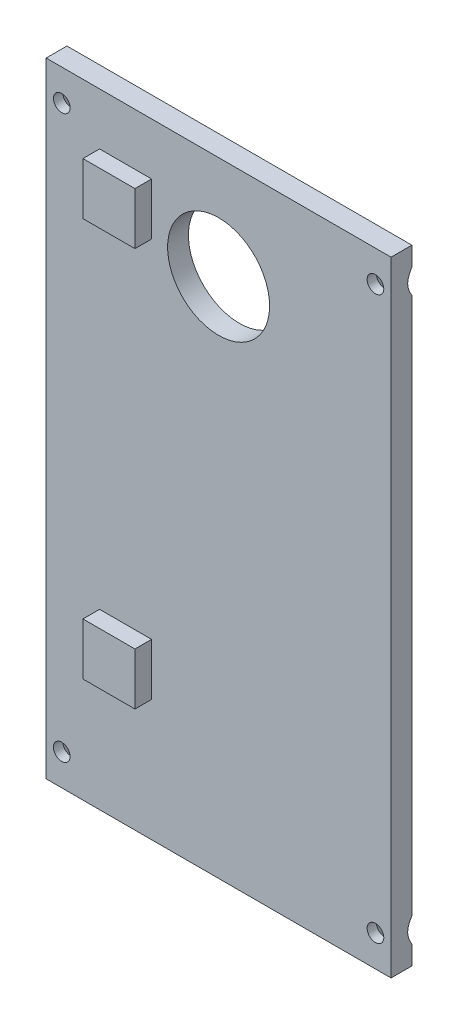
ISO-10303-21;
HEADER;
FILE_DESCRIPTION(('STEP AP214'),'2;1');
FILE_NAME('part.step','',(''),(''),'','','');
FILE_SCHEMA(('AUTOMOTIVE_DESIGN { 1 0 10303 214 1 1 1 1 }'));
ENDSEC;
DATA;
#1=APPLICATION_CONTEXT('core data for automotive mechanical design processes');
#2=APPLICATION_PROTOCOL_DEFINITION('international standard','automotive_design',2000,#1);
#3=PRODUCT_CONTEXT('',#1,'mechanical');
#4=PRODUCT('Part','Part','',(#3));
#5=PRODUCT_RELATED_PRODUCT_CATEGORY('part','',(#4));
#6=PRODUCT_DEFINITION_FORMATION('','',#4);
#7=PRODUCT_DEFINITION_CONTEXT('part definition',#1,'design');
#8=PRODUCT_DEFINITION('design','',#6,#7);
#9=PRODUCT_DEFINITION_SHAPE('','',#8);
#10=(LENGTH_UNIT() NAMED_UNIT(*) SI_UNIT(.MILLI.,.METRE.));
#11=(NAMED_UNIT(*) PLANE_ANGLE_UNIT() SI_UNIT($,.RADIAN.));
#12=(NAMED_UNIT(*) SI_UNIT($,.STERADIAN.) SOLID_ANGLE_UNIT());
#13=UNCERTAINTY_MEASURE_WITH_UNIT(LENGTH_MEASURE(1.E-05),#10,'distance_accuracy_value','');
#14=(GEOMETRIC_REPRESENTATION_CONTEXT(3) GLOBAL_UNCERTAINTY_ASSIGNED_CONTEXT((#13)) GLOBAL_UNIT_ASSIGNED_CONTEXT((#10,
#11,#12)) REPRESENTATION_CONTEXT('',''));
#15=CARTESIAN_POINT('',(0.,0.,0.));
#16=DIRECTION('',(0.,0.,1.));
#17=DIRECTION('',(1.,0.,0.));
#18=AXIS2_PLACEMENT_3D('',#15,#16,#17);
#19=CARTESIAN_POINT('',(0.,0.,2.));
#20=DIRECTION('',(0.,0.,-1.));
#21=DIRECTION('',(-1.,0.,0.));
#22=AXIS2_PLACEMENT_3D('',#19,#20,#21);
#23=PLANE('',#22);
#24=CARTESIAN_POINT('',(15.075,-27.,2.));
#25=DIRECTION('',(0.,0.,-1.));
#26=DIRECTION('',(-1.,0.,0.));
#27=AXIS2_PLACEMENT_3D('',#24,#25,#26);
#28=CIRCLE('',#27,0.8);
#29=CARTESIAN_POINT('',(14.275,-27.,2.));
#30=VERTEX_POINT('',#29);
#31=EDGE_CURVE('E410',#30,#30,#28,.F.);
#32=ORIENTED_EDGE('',*,*,#31,.F.);
#33=EDGE_LOOP('',(#32));
#34=FACE_BOUND('',#33,.T.);
#35=CARTESIAN_POINT('',(-15.075,-27.,2.));
#36=DIRECTION('',(0.,0.,-1.));
#37=DIRECTION('',(-1.,0.,0.));
#38=AXIS2_PLACEMENT_3D('',#35,#36,#37);
#39=CIRCLE('',#38,0.8);
#40=CARTESIAN_POINT('',(-15.875,-27.,2.));
#41=VERTEX_POINT('',#40);
#42=EDGE_CURVE('E405',#41,#41,#39,.F.);
#43=ORIENTED_EDGE('',*,*,#42,.F.);
#44=EDGE_LOOP('',(#43));
#45=FACE_BOUND('',#44,.T.);
#46=CARTESIAN_POINT('',(-15.075,27.,2.));
#47=DIRECTION('',(0.,0.,-1.));
#48=DIRECTION('',(-1.,0.,0.));
#49=AXIS2_PLACEMENT_3D('',#46,#47,#48);
#50=CIRCLE('',#49,0.8);
#51=CARTESIAN_POINT('',(-15.875,27.,2.));
#52=VERTEX_POINT('',#51);
#53=EDGE_CURVE('E402',#52,#52,#50,.F.);
#54=ORIENTED_EDGE('',*,*,#53,.F.);
#55=EDGE_LOOP('',(#54));
#56=FACE_BOUND('',#55,.T.);
#57=CARTESIAN_POINT('',(15.075,27.,2.));
#58=DIRECTION('',(0.,0.,-1.));
#59=DIRECTION('',(-1.,0.,0.));
#60=AXIS2_PLACEMENT_3D('',#57,#58,#59);
#61=CIRCLE('',#60,0.8);
#62=CARTESIAN_POINT('',(14.275,27.,2.));
#63=VERTEX_POINT('',#62);
#64=EDGE_CURVE('E404',#63,#63,#61,.F.);
#65=ORIENTED_EDGE('',*,*,#64,.F.);
#66=EDGE_LOOP('',(#65));
#67=FACE_BOUND('',#66,.T.);
#68=DIRECTION('',(0.,-1.,0.));
#69=VECTOR('',#68,1.);
#70=CARTESIAN_POINT('',(-11.44,25.,2.));
#71=LINE('',#70,#69);
#72=CARTESIAN_POINT('',(-11.44,25.,2.));
#73=VERTEX_POINT('',#72);
#74=CARTESIAN_POINT('',(-11.44,20.,2.));
#75=VERTEX_POINT('',#74);
#76=EDGE_CURVE('E176',#73,#75,#71,.T.);
#77=ORIENTED_EDGE('',*,*,#76,.F.);
#78=DIRECTION('',(-1.,0.,0.));
#79=VECTOR('',#78,1.);
#80=CARTESIAN_POINT('',(-11.44,25.,2.));
#81=LINE('',#80,#79);
#82=CARTESIAN_POINT('',(-6.44,25.,2.));
#83=VERTEX_POINT('',#82);
#84=EDGE_CURVE('E189',#83,#73,#81,.T.);
#85=ORIENTED_EDGE('',*,*,#84,.F.);
#86=DIRECTION('',(0.,1.,0.));
#87=VECTOR('',#86,1.);
#88=CARTESIAN_POINT('',(-6.44,25.,2.));
#89=LINE('',#88,#87);
#90=CARTESIAN_POINT('',(-6.44,20.,2.));
#91=VERTEX_POINT('',#90);
#92=EDGE_CURVE('E198',#91,#83,#89,.T.);
#93=ORIENTED_EDGE('',*,*,#92,.F.);
#94=DIRECTION('',(1.,0.,0.));
#95=VECTOR('',#94,1.);
#96=CARTESIAN_POINT('',(-11.44,20.,2.));
#97=LINE('',#96,#95);
#98=EDGE_CURVE('E179',#75,#91,#97,.T.);
#99=ORIENTED_EDGE('',*,*,#98,.F.);
#100=EDGE_LOOP('',(#77,#85,#93,#99));
#101=FACE_BOUND('',#100,.T.);
#102=DIRECTION('',(0.,1.,0.));
#103=VECTOR('',#102,1.);
#104=CARTESIAN_POINT('',(16.575,-30.,2.));
#105=LINE('',#104,#103);
#106=CARTESIAN_POINT('',(16.575,-30.,2.));
#107=VERTEX_POINT('',#106);
#108=CARTESIAN_POINT('',(16.575,30.,2.));
#109=VERTEX_POINT('',#108);
#110=EDGE_CURVE('E221',#107,#109,#105,.T.);
#111=ORIENTED_EDGE('',*,*,#110,.T.);
#112=DIRECTION('',(-1.,0.,0.));
#113=VECTOR('',#112,1.);
#114=CARTESIAN_POINT('',(-16.575,30.,2.));
#115=LINE('',#114,#113);
#116=CARTESIAN_POINT('',(-16.575,30.,2.));
#117=VERTEX_POINT('',#116);
#118=EDGE_CURVE('E224',#109,#117,#115,.T.);
#119=ORIENTED_EDGE('',*,*,#118,.T.);
#120=DIRECTION('',(0.,-1.,0.));
#121=VECTOR('',#120,1.);
#122=CARTESIAN_POINT('',(-16.575,-30.,2.));
#123=LINE('',#122,#121);
#124=CARTESIAN_POINT('',(-16.575,-30.,2.));
#125=VERTEX_POINT('',#124);
#126=EDGE_CURVE('E227',#117,#125,#123,.T.);
#127=ORIENTED_EDGE('',*,*,#126,.T.);
#128=DIRECTION('',(1.,0.,0.));
#129=VECTOR('',#128,1.);
#130=CARTESIAN_POINT('',(-16.575,-30.,2.));
#131=LINE('',#130,#129);
#132=EDGE_CURVE('E229',#125,#107,#131,.T.);
#133=ORIENTED_EDGE('',*,*,#132,.T.);
#134=EDGE_LOOP('',(#111,#119,#127,#133));
#135=FACE_BOUND('',#134,.T.);
#136=CARTESIAN_POINT('',(0.,20.1,2.));
#137=DIRECTION('',(0.,0.,1.));
#138=DIRECTION('',(1.,0.,0.));
#139=AXIS2_PLACEMENT_3D('',#136,#137,#138);
#140=CIRCLE('',#139,4.9);
#141=CARTESIAN_POINT('',(4.9,20.1,2.));
#142=VERTEX_POINT('',#141);
#143=EDGE_CURVE('E215',#142,#142,#140,.T.);
#144=ORIENTED_EDGE('',*,*,#143,.F.);
#145=EDGE_LOOP('',(#144));
#146=FACE_BOUND('',#145,.T.);
#147=DIRECTION('',(0.,-1.,0.));
#148=VECTOR('',#147,1.);
#149=CARTESIAN_POINT('',(-11.44,-18.32,2.));
#150=LINE('',#149,#148);
#151=CARTESIAN_POINT('',(-11.44,-13.32,2.));
#152=VERTEX_POINT('',#151);
#153=CARTESIAN_POINT('',(-11.44,-18.32,2.));
#154=VERTEX_POINT('',#153);
#155=EDGE_CURVE('E175',#152,#154,#150,.T.);
#156=ORIENTED_EDGE('',*,*,#155,.F.);
#157=DIRECTION('',(-1.,0.,0.));
#158=VECTOR('',#157,1.);
#159=CARTESIAN_POINT('',(-11.44,-13.32,2.));
#160=LINE('',#159,#158);
#161=CARTESIAN_POINT('',(-6.43999999999999,-13.32,2.));
#162=VERTEX_POINT('',#161);
#163=EDGE_CURVE('E172',#162,#152,#160,.T.);
#164=ORIENTED_EDGE('',*,*,#163,.F.);
#165=DIRECTION('',(0.,1.,0.));
#166=VECTOR('',#165,1.);
#167=CARTESIAN_POINT('',(-6.43999999999999,-18.32,2.));
#168=LINE('',#167,#166);
#169=CARTESIAN_POINT('',(-6.43999999999999,-18.32,2.));
#170=VERTEX_POINT('',#169);
#171=EDGE_CURVE('E421',#170,#162,#168,.T.);
#172=ORIENTED_EDGE('',*,*,#171,.F.);
#173=DIRECTION('',(1.,0.,0.));
#174=VECTOR('',#173,1.);
#175=CARTESIAN_POINT('',(-11.44,-18.32,2.));
#176=LINE('',#175,#174);
#177=EDGE_CURVE('E419',#154,#170,#176,.T.);
#178=ORIENTED_EDGE('',*,*,#177,.F.);
#179=EDGE_LOOP('',(#156,#164,#172,#178));
#180=FACE_BOUND('',#179,.T.);
#181=ADVANCED_FACE('F37',(#34,#45,#56,#67,#101,#135,#146,#180),#23,.F.);
#182=CARTESIAN_POINT('',(0.,0.,0.));
#183=DIRECTION('',(0.,0.,-1.));
#184=DIRECTION('',(-1.,0.,0.));
#185=AXIS2_PLACEMENT_3D('',#182,#183,#184);
#186=PLANE('',#185);
#187=DIRECTION('',(0.,-1.,0.));
#188=VECTOR('',#187,1.);
#189=CARTESIAN_POINT('',(-16.575,-30.,0.));
#190=LINE('',#189,#188);
#191=CARTESIAN_POINT('',(-16.575,-28.1661903789691,0.));
#192=VERTEX_POINT('',#191);
#193=CARTESIAN_POINT('',(-16.575,-30.,0.));
#194=VERTEX_POINT('',#193);
#195=EDGE_CURVE('E238',#192,#194,#190,.T.);
#196=ORIENTED_EDGE('',*,*,#195,.F.);
#197=CARTESIAN_POINT('',(-15.075,-27.,0.));
#198=DIRECTION('',(0.,0.,-1.));
#199=DIRECTION('',(-1.,0.,0.));
#200=AXIS2_PLACEMENT_3D('',#197,#198,#199);
#201=CIRCLE('',#200,1.9);
#202=CARTESIAN_POINT('',(-16.575,-25.8338096210309,0.));
#203=VERTEX_POINT('',#202);
#204=EDGE_CURVE('E267',#192,#203,#201,.F.);
#205=ORIENTED_EDGE('',*,*,#204,.T.);
#206=CARTESIAN_POINT('',(-16.575,25.8338096210309,0.));
#207=VERTEX_POINT('',#206);
#208=EDGE_CURVE('E242',#207,#203,#190,.T.);
#209=ORIENTED_EDGE('',*,*,#208,.F.);
#210=CARTESIAN_POINT('',(-15.075,27.,0.));
#211=DIRECTION('',(0.,0.,-1.));
#212=DIRECTION('',(-1.,0.,0.));
#213=AXIS2_PLACEMENT_3D('',#210,#211,#212);
#214=CIRCLE('',#213,1.90000000000001);
#215=CARTESIAN_POINT('',(-16.575,28.1661903789691,0.));
#216=VERTEX_POINT('',#215);
#217=EDGE_CURVE('E261',#207,#216,#214,.F.);
#218=ORIENTED_EDGE('',*,*,#217,.T.);
#219=CARTESIAN_POINT('',(-16.575,30.,0.));
#220=VERTEX_POINT('',#219);
#221=EDGE_CURVE('E239',#220,#216,#190,.T.);
#222=ORIENTED_EDGE('',*,*,#221,.F.);
#223=DIRECTION('',(-1.,0.,0.));
#224=VECTOR('',#223,1.);
#225=CARTESIAN_POINT('',(-16.575,30.,0.));
#226=LINE('',#225,#224);
#227=CARTESIAN_POINT('',(16.575,30.,0.));
#228=VERTEX_POINT('',#227);
#229=EDGE_CURVE('E235',#228,#220,#226,.T.);
#230=ORIENTED_EDGE('',*,*,#229,.F.);
#231=DIRECTION('',(0.,1.,0.));
#232=VECTOR('',#231,1.);
#233=CARTESIAN_POINT('',(16.575,-30.,0.));
#234=LINE('',#233,#232);
#235=CARTESIAN_POINT('',(16.575,28.1661903789691,0.));
#236=VERTEX_POINT('',#235);
#237=EDGE_CURVE('E218',#236,#228,#234,.T.);
#238=ORIENTED_EDGE('',*,*,#237,.F.);
#239=CARTESIAN_POINT('',(15.075,27.,0.));
#240=DIRECTION('',(0.,0.,-1.));
#241=DIRECTION('',(-1.,0.,0.));
#242=AXIS2_PLACEMENT_3D('',#239,#240,#241);
#243=CIRCLE('',#242,1.90000000000001);
#244=CARTESIAN_POINT('',(16.575,25.8338096210309,0.));
#245=VERTEX_POINT('',#244);
#246=EDGE_CURVE('E258',#236,#245,#243,.F.);
#247=ORIENTED_EDGE('',*,*,#246,.T.);
#248=CARTESIAN_POINT('',(16.575,-25.8338096210309,0.));
#249=VERTEX_POINT('',#248);
#250=EDGE_CURVE('E236',#249,#245,#234,.T.);
#251=ORIENTED_EDGE('',*,*,#250,.F.);
#252=CARTESIAN_POINT('',(15.075,-27.,0.));
#253=DIRECTION('',(0.,0.,-1.));
#254=DIRECTION('',(-1.,0.,0.));
#255=AXIS2_PLACEMENT_3D('',#252,#253,#254);
#256=CIRCLE('',#255,1.9);
#257=CARTESIAN_POINT('',(16.575,-28.1661903789691,0.));
#258=VERTEX_POINT('',#257);
#259=EDGE_CURVE('E264',#249,#258,#256,.F.);
#260=ORIENTED_EDGE('',*,*,#259,.T.);
#261=CARTESIAN_POINT('',(16.575,-30.,0.));
#262=VERTEX_POINT('',#261);
#263=EDGE_CURVE('E232',#262,#258,#234,.T.);
#264=ORIENTED_EDGE('',*,*,#263,.F.);
#265=DIRECTION('',(1.,0.,0.));
#266=VECTOR('',#265,1.);
#267=CARTESIAN_POINT('',(-16.575,-30.,0.));
#268=LINE('',#267,#266);
#269=EDGE_CURVE('E225',#194,#262,#268,.T.);
#270=ORIENTED_EDGE('',*,*,#269,.F.);
#271=EDGE_LOOP('',(#196,#205,#209,#218,#222,#230,#238,#247,#251,#260,#264,#270));
#272=FACE_BOUND('',#271,.T.);
#273=CARTESIAN_POINT('',(0.,20.1,0.));
#274=DIRECTION('',(0.,0.,1.));
#275=DIRECTION('',(1.,0.,0.));
#276=AXIS2_PLACEMENT_3D('',#273,#274,#275);
#277=CIRCLE('',#276,4.9);
#278=CARTESIAN_POINT('',(4.9,20.1,0.));
#279=VERTEX_POINT('',#278);
#280=EDGE_CURVE('E214',#279,#279,#277,.T.);
#281=ORIENTED_EDGE('',*,*,#280,.T.);
#282=EDGE_LOOP('',(#281));
#283=FACE_BOUND('',#282,.T.);
#284=ADVANCED_FACE('F301',(#272,#283),#186,.T.);
#285=CARTESIAN_POINT('',(16.575,-30.,2.));
#286=DIRECTION('',(-1.,0.,0.));
#287=DIRECTION('',(0.,0.,1.));
#288=AXIS2_PLACEMENT_3D('',#285,#286,#287);
#289=PLANE('',#288);
#290=ORIENTED_EDGE('',*,*,#263,.T.);
#291=CARTESIAN_POINT('',(16.575,-28.1661903789691,0.));
#292=CARTESIAN_POINT('',(16.575,-28.1098869582144,0.0345160849700438));
#293=CARTESIAN_POINT('',(16.575,-28.052884062325,0.0679833097713289));
#294=CARTESIAN_POINT('',(16.575,-27.9370049965794,0.132064177172169));
#295=CARTESIAN_POINT('',(16.575,-27.8781222104217,0.16266579223065));
#296=CARTESIAN_POINT('',(16.575,-27.7572349326968,0.22055323446922));
#297=CARTESIAN_POINT('',(16.575,-27.6951912289957,0.247758467722138));
#298=CARTESIAN_POINT('',(16.575,-27.5690542490833,0.296735949578689));
#299=CARTESIAN_POINT('',(16.575,-27.5049643527016,0.318516682516274));
#300=CARTESIAN_POINT('',(16.575,-27.3961216491668,0.349145873602359));
#301=CARTESIAN_POINT('',(16.575,-27.351904335671,0.359893863886948));
#302=CARTESIAN_POINT('',(16.575,-27.2627339086583,0.377789991218416));
#303=CARTESIAN_POINT('',(16.575,-27.21778078842,0.384938095362319));
#304=CARTESIAN_POINT('',(16.575,-27.1278482728512,0.395217663275402));
#305=CARTESIAN_POINT('',(16.575,-27.0828732658238,0.39838699827426));
#306=CARTESIAN_POINT('',(16.575,-26.992821239759,0.400658210638996));
#307=CARTESIAN_POINT('',(16.575,-26.9477442257016,0.399760282462218));
#308=CARTESIAN_POINT('',(16.575,-26.8579019498696,0.393950741552011));
#309=CARTESIAN_POINT('',(16.575,-26.813136400915,0.389043522237889));
#310=CARTESIAN_POINT('',(16.575,-26.7241680921339,0.375484994088497));
#311=CARTESIAN_POINT('',(16.575,-26.6799656203169,0.366831842617303));
#312=CARTESIAN_POINT('',(16.575,-26.5477956008205,0.335671095401709));
#313=CARTESIAN_POINT('',(16.575,-26.4610201744106,0.308022015693196));
#314=CARTESIAN_POINT('',(16.575,-26.3283894749536,0.25710761580979));
#315=CARTESIAN_POINT('',(16.575,-26.2811637915004,0.237172817748053));
#316=CARTESIAN_POINT('',(16.575,-26.1878432301305,0.194750653735505));
#317=CARTESIAN_POINT('',(16.575,-26.1417487624194,0.172262377992723));
#318=CARTESIAN_POINT('',(16.575,-26.0514790677704,0.125677466928333));
#319=CARTESIAN_POINT('',(16.575,-26.0072840838516,0.101618598693392));
#320=CARTESIAN_POINT('',(16.575,-25.9198633969326,0.0519149578077792));
#321=CARTESIAN_POINT('',(16.575,-25.8766365836292,0.0262721434816943));
#322=CARTESIAN_POINT('',(16.575,-25.8338096210309,0.));
#323=B_SPLINE_CURVE_WITH_KNOTS('',3,(#291,#292,#293,#294,#295,#296,#297,#298,#299,#300,#301,
#302,#303,#304,#305,#306,#307,#308,#309,#310,#311,#312,#313,#314,#315,#316,#317,#318,#319,#320,
#321,#322),.UNSPECIFIED.,.F.,.F.,(4,2,2,2,2,2,2,2,2,2,2,2,2,2,2,4),(0.,0.198184712729232,
0.397167098794746,0.600218168983853,0.802949628570246,0.939337174307459,1.07572596660486,
1.21080647236082,1.34588051993642,1.48080675029598,1.61579942684851,1.88803011748939,
2.04176353655462,2.19555190300684,2.34647530618956,2.49721571059815),.UNSPECIFIED.);
#324=EDGE_CURVE('E314',#258,#249,#323,.T.);
#325=ORIENTED_EDGE('',*,*,#324,.T.);
#326=ORIENTED_EDGE('',*,*,#250,.T.);
#327=CARTESIAN_POINT('',(16.575,25.8338096210309,0.));
#328=CARTESIAN_POINT('',(16.575,25.8901130417856,0.0345160849700436));
#329=CARTESIAN_POINT('',(16.575,25.9471159376749,0.067983309771329));
#330=CARTESIAN_POINT('',(16.575,26.0629950034205,0.132064177172171));
#331=CARTESIAN_POINT('',(16.575,26.1218777895783,0.162665792230653));
#332=CARTESIAN_POINT('',(16.575,26.2427650673032,0.220553234469225));
#333=CARTESIAN_POINT('',(16.575,26.3048087710043,0.247758467722143));
#334=CARTESIAN_POINT('',(16.575,26.4309457509167,0.296735949578696));
#335=CARTESIAN_POINT('',(16.575,26.4950356472983,0.318516682516282));
#336=CARTESIAN_POINT('',(16.575,26.6038783508332,0.349145873602369));
#337=CARTESIAN_POINT('',(16.575,26.648095664329,0.359893863886959));
#338=CARTESIAN_POINT('',(16.575,26.7372660913416,0.377789991218428));
#339=CARTESIAN_POINT('',(16.575,26.78221921158,0.384938095362332));
#340=CARTESIAN_POINT('',(16.575,26.8721517271488,0.395217663275415));
#341=CARTESIAN_POINT('',(16.575,26.9171267341762,0.398386998274273));
#342=CARTESIAN_POINT('',(16.575,27.007178760241,0.40065821063901));
#343=CARTESIAN_POINT('',(16.575,27.0522557742984,0.399760282462233));
#344=CARTESIAN_POINT('',(16.575,27.1420980501304,0.393950741552028));
#345=CARTESIAN_POINT('',(16.575,27.186863599085,0.389043522237906));
#346=CARTESIAN_POINT('',(16.575,27.2758319078661,0.375484994088515));
#347=CARTESIAN_POINT('',(16.575,27.3200343796831,0.366831842617321));
#348=CARTESIAN_POINT('',(16.575,27.4522043991795,0.335671095401729));
#349=CARTESIAN_POINT('',(16.575,27.5389798255894,0.308022015693217));
#350=CARTESIAN_POINT('',(16.575,27.6716105250464,0.257107615809811));
#351=CARTESIAN_POINT('',(16.575,27.7188362084996,0.237172817748073));
#352=CARTESIAN_POINT('',(16.575,27.8121567698694,0.194750653735522));
#353=CARTESIAN_POINT('',(16.575,27.8582512375806,0.172262377992738));
#354=CARTESIAN_POINT('',(16.575,27.9485209322296,0.125677466928343));
#355=CARTESIAN_POINT('',(16.575,27.9927159161484,0.1016185986934));
#356=CARTESIAN_POINT('',(16.575,28.0801366030674,0.0519149578077824));
#357=CARTESIAN_POINT('',(16.575,28.1233634163708,0.0262721434816948));
#358=CARTESIAN_POINT('',(16.575,28.1661903789691,0.));
#359=B_SPLINE_CURVE_WITH_KNOTS('',3,(#327,#328,#329,#330,#331,#332,#333,#334,#335,#336,#337,
#338,#339,#340,#341,#342,#343,#344,#345,#346,#347,#348,#349,#350,#351,#352,#353,#354,#355,#356,
#357,#358),.UNSPECIFIED.,.F.,.F.,(4,2,2,2,2,2,2,2,2,2,2,2,2,2,2,4),(0.,0.198184712729232,
0.397167098794751,0.600218168983852,0.802949628570253,0.939337174307467,1.07572596660487,
1.21080647236083,1.34588051993642,1.48080675029598,1.61579942684851,1.88803011748939,
2.04176353655463,2.19555190300686,2.34647530618959,2.49721571059819),.UNSPECIFIED.);
#360=EDGE_CURVE('E308',#245,#236,#359,.T.);
#361=ORIENTED_EDGE('',*,*,#360,.T.);
#362=ORIENTED_EDGE('',*,*,#237,.T.);
#363=DIRECTION('',(0.,0.,-1.));
#364=VECTOR('',#363,1.);
#365=CARTESIAN_POINT('',(16.575,30.,2.));
#366=LINE('',#365,#364);
#367=EDGE_CURVE('E252',#109,#228,#366,.T.);
#368=ORIENTED_EDGE('',*,*,#367,.F.);
#369=ORIENTED_EDGE('',*,*,#110,.F.);
#370=DIRECTION('',(0.,0.,-1.));
#371=VECTOR('',#370,1.);
#372=CARTESIAN_POINT('',(16.575,-30.,2.));
#373=LINE('',#372,#371);
#374=EDGE_CURVE('E231',#107,#262,#373,.T.);
#375=ORIENTED_EDGE('',*,*,#374,.T.);
#376=EDGE_LOOP('',(#290,#325,#326,#361,#362,#368,#369,#375));
#377=FACE_BOUND('',#376,.T.);
#378=ADVANCED_FACE('F297',(#377),#289,.F.);
#379=CARTESIAN_POINT('',(-16.575,30.,2.));
#380=DIRECTION('',(0.,-1.,0.));
#381=DIRECTION('',(0.,0.,-1.));
#382=AXIS2_PLACEMENT_3D('',#379,#380,#381);
#383=PLANE('',#382);
#384=ORIENTED_EDGE('',*,*,#229,.T.);
#385=DIRECTION('',(0.,0.,-1.));
#386=VECTOR('',#385,1.);
#387=CARTESIAN_POINT('',(-16.575,30.,2.));
#388=LINE('',#387,#386);
#389=EDGE_CURVE('E249',#117,#220,#388,.T.);
#390=ORIENTED_EDGE('',*,*,#389,.F.);
#391=ORIENTED_EDGE('',*,*,#118,.F.);
#392=ORIENTED_EDGE('',*,*,#367,.T.);
#393=EDGE_LOOP('',(#384,#390,#391,#392));
#394=FACE_BOUND('',#393,.T.);
#395=ADVANCED_FACE('F292',(#394),#383,.F.);
#396=CARTESIAN_POINT('',(-16.575,-30.,2.));
#397=DIRECTION('',(1.,0.,0.));
#398=DIRECTION('',(0.,0.,-1.));
#399=AXIS2_PLACEMENT_3D('',#396,#397,#398);
#400=PLANE('',#399);
#401=ORIENTED_EDGE('',*,*,#208,.T.);
#402=CARTESIAN_POINT('',(-16.575,-25.8338096210309,0.));
#403=CARTESIAN_POINT('',(-16.575,-25.8901130417856,0.0345160849700431));
#404=CARTESIAN_POINT('',(-16.575,-25.947115937675,0.0679833097713276));
#405=CARTESIAN_POINT('',(-16.575,-26.0629950034206,0.132064177172168));
#406=CARTESIAN_POINT('',(-16.575,-26.1218777895783,0.16266579223065));
#407=CARTESIAN_POINT('',(-16.575,-26.2427650673032,0.220553234469221));
#408=CARTESIAN_POINT('',(-16.575,-26.3048087710043,0.247758467722139));
#409=CARTESIAN_POINT('',(-16.575,-26.4309457509167,0.296735949578689));
#410=CARTESIAN_POINT('',(-16.575,-26.4950356472983,0.318516682516274));
#411=CARTESIAN_POINT('',(-16.575,-26.6038783508332,0.349145873602359));
#412=CARTESIAN_POINT('',(-16.575,-26.648095664329,0.359893863886948));
#413=CARTESIAN_POINT('',(-16.575,-26.7372660913417,0.377789991218416));
#414=CARTESIAN_POINT('',(-16.575,-26.78221921158,0.38493809536232));
#415=CARTESIAN_POINT('',(-16.575,-26.8721517271488,0.395217663275402));
#416=CARTESIAN_POINT('',(-16.575,-26.9171267341762,0.39838699827426));
#417=CARTESIAN_POINT('',(-16.575,-27.007178760241,0.400658210638996));
#418=CARTESIAN_POINT('',(-16.575,-27.0522557742984,0.399760282462218));
#419=CARTESIAN_POINT('',(-16.575,-27.1420980501304,0.393950741552011));
#420=CARTESIAN_POINT('',(-16.575,-27.186863599085,0.389043522237889));
#421=CARTESIAN_POINT('',(-16.575,-27.2758319078661,0.375484994088497));
#422=CARTESIAN_POINT('',(-16.575,-27.3200343796831,0.366831842617303));
#423=CARTESIAN_POINT('',(-16.575,-27.4522043991795,0.335671095401709));
#424=CARTESIAN_POINT('',(-16.575,-27.5389798255894,0.308022015693197));
#425=CARTESIAN_POINT('',(-16.575,-27.6716105250464,0.257107615809789));
#426=CARTESIAN_POINT('',(-16.575,-27.7188362084996,0.237172817748052));
#427=CARTESIAN_POINT('',(-16.575,-27.8121567698694,0.194750653735504));
#428=CARTESIAN_POINT('',(-16.575,-27.8582512375806,0.172262377992722));
#429=CARTESIAN_POINT('',(-16.575,-27.9485209322296,0.125677466928333));
#430=CARTESIAN_POINT('',(-16.575,-27.9927159161484,0.101618598693392));
#431=CARTESIAN_POINT('',(-16.575,-28.0801366030674,0.0519149578077791));
#432=CARTESIAN_POINT('',(-16.575,-28.1233634163708,0.0262721434816941));
#433=CARTESIAN_POINT('',(-16.575,-28.1661903789691,0.));
#434=B_SPLINE_CURVE_WITH_KNOTS('',3,(#402,#403,#404,#405,#406,#407,#408,#409,#410,#411,#412,
#413,#414,#415,#416,#417,#418,#419,#420,#421,#422,#423,#424,#425,#426,#427,#428,#429,#430,#431,
#432,#433),.UNSPECIFIED.,.F.,.F.,(4,2,2,2,2,2,2,2,2,2,2,2,2,2,2,4),(0.,0.198184712729228,
0.397167098794746,0.600218168983853,0.802949628570246,0.939337174307459,1.07572596660486,
1.21080647236083,1.34588051993642,1.48080675029598,1.61579942684851,1.88803011748939,
2.04176353655462,2.19555190300684,2.34647530618956,2.49721571059815),.UNSPECIFIED.);
#435=EDGE_CURVE('E54',#203,#192,#434,.T.);
#436=ORIENTED_EDGE('',*,*,#435,.T.);
#437=ORIENTED_EDGE('',*,*,#195,.T.);
#438=DIRECTION('',(0.,0.,-1.));
#439=VECTOR('',#438,1.);
#440=CARTESIAN_POINT('',(-16.575,-30.,2.));
#441=LINE('',#440,#439);
#442=EDGE_CURVE('E246',#125,#194,#441,.T.);
#443=ORIENTED_EDGE('',*,*,#442,.F.);
#444=ORIENTED_EDGE('',*,*,#126,.F.);
#445=ORIENTED_EDGE('',*,*,#389,.T.);
#446=ORIENTED_EDGE('',*,*,#221,.T.);
#447=CARTESIAN_POINT('',(-16.575,28.1661903789691,0.));
#448=CARTESIAN_POINT('',(-16.575,28.1098869582144,0.0345160849700435));
#449=CARTESIAN_POINT('',(-16.575,28.0528840623251,0.067983309771329));
#450=CARTESIAN_POINT('',(-16.575,27.9370049965795,0.132064177172171));
#451=CARTESIAN_POINT('',(-16.575,27.8781222104217,0.162665792230654));
#452=CARTESIAN_POINT('',(-16.575,27.7572349326968,0.220553234469227));
#453=CARTESIAN_POINT('',(-16.575,27.6951912289957,0.247758467722147));
#454=CARTESIAN_POINT('',(-16.575,27.5690542490833,0.296735949578699));
#455=CARTESIAN_POINT('',(-16.575,27.5049643527017,0.318516682516283));
#456=CARTESIAN_POINT('',(-16.575,27.3961216491668,0.349145873602369));
#457=CARTESIAN_POINT('',(-16.575,27.351904335671,0.359893863886959));
#458=CARTESIAN_POINT('',(-16.575,27.2627339086584,0.377789991218428));
#459=CARTESIAN_POINT('',(-16.575,27.21778078842,0.384938095362331));
#460=CARTESIAN_POINT('',(-16.575,27.1278482728512,0.395217663275415));
#461=CARTESIAN_POINT('',(-16.575,27.0828732658238,0.398386998274273));
#462=CARTESIAN_POINT('',(-16.575,26.992821239759,0.40065821063901));
#463=CARTESIAN_POINT('',(-16.575,26.9477442257016,0.399760282462233));
#464=CARTESIAN_POINT('',(-16.575,26.8579019498696,0.393950741552028));
#465=CARTESIAN_POINT('',(-16.575,26.813136400915,0.389043522237906));
#466=CARTESIAN_POINT('',(-16.575,26.7241680921339,0.375484994088515));
#467=CARTESIAN_POINT('',(-16.575,26.6799656203169,0.366831842617321));
#468=CARTESIAN_POINT('',(-16.575,26.5477956008205,0.335671095401729));
#469=CARTESIAN_POINT('',(-16.575,26.4610201744106,0.308022015693217));
#470=CARTESIAN_POINT('',(-16.575,26.3283894749536,0.257107615809811));
#471=CARTESIAN_POINT('',(-16.575,26.2811637915004,0.237172817748073));
#472=CARTESIAN_POINT('',(-16.575,26.1878432301306,0.194750653735522));
#473=CARTESIAN_POINT('',(-16.575,26.1417487624194,0.172262377992737));
#474=CARTESIAN_POINT('',(-16.575,26.0514790677704,0.125677466928342));
#475=CARTESIAN_POINT('',(-16.575,26.0072840838516,0.101618598693399));
#476=CARTESIAN_POINT('',(-16.575,25.9198633969326,0.0519149578077807));
#477=CARTESIAN_POINT('',(-16.575,25.8766365836292,0.0262721434816944));
#478=CARTESIAN_POINT('',(-16.575,25.8338096210309,0.));
#479=B_SPLINE_CURVE_WITH_KNOTS('',3,(#447,#448,#449,#450,#451,#452,#453,#454,#455,#456,#457,
#458,#459,#460,#461,#462,#463,#464,#465,#466,#467,#468,#469,#470,#471,#472,#473,#474,#475,#476,
#477,#478),.UNSPECIFIED.,.F.,.F.,(4,2,2,2,2,2,2,2,2,2,2,2,2,2,2,4),(0.,0.198184712729232,
0.397167098794751,0.600218168983867,0.802949628570253,0.939337174307467,1.07572596660486,
1.21080647236083,1.34588051993642,1.48080675029598,1.61579942684851,1.88803011748939,
2.04176353655463,2.19555190300686,2.3464753061896,2.49721571059819),.UNSPECIFIED.);
#480=EDGE_CURVE('E269',#216,#207,#479,.T.);
#481=ORIENTED_EDGE('',*,*,#480,.T.);
#482=EDGE_LOOP('',(#401,#436,#437,#443,#444,#445,#446,#481));
#483=FACE_BOUND('',#482,.T.);
#484=ADVANCED_FACE('F286',(#483),#400,.F.);
#485=CARTESIAN_POINT('',(-16.575,-30.,2.));
#486=DIRECTION('',(0.,1.,0.));
#487=DIRECTION('',(0.,0.,1.));
#488=AXIS2_PLACEMENT_3D('',#485,#486,#487);
#489=PLANE('',#488);
#490=ORIENTED_EDGE('',*,*,#269,.T.);
#491=ORIENTED_EDGE('',*,*,#374,.F.);
#492=ORIENTED_EDGE('',*,*,#132,.F.);
#493=ORIENTED_EDGE('',*,*,#442,.T.);
#494=EDGE_LOOP('',(#490,#491,#492,#493));
#495=FACE_BOUND('',#494,.T.);
#496=ADVANCED_FACE('F291',(#495),#489,.F.);
#497=CARTESIAN_POINT('',(0.,20.1,2.));
#498=DIRECTION('',(0.,0.,-1.));
#499=DIRECTION('',(-1.,0.,0.));
#500=AXIS2_PLACEMENT_3D('',#497,#498,#499);
#501=CYLINDRICAL_SURFACE('',#500,4.9);
#502=ORIENTED_EDGE('',*,*,#143,.T.);
#503=EDGE_LOOP('',(#502));
#504=FACE_BOUND('',#503,.T.);
#505=ORIENTED_EDGE('',*,*,#280,.F.);
#506=EDGE_LOOP('',(#505));
#507=FACE_BOUND('',#506,.T.);
#508=ADVANCED_FACE('F343',(#504,#507),#501,.F.);
#509=CARTESIAN_POINT('',(-11.44,25.,3.6));
#510=DIRECTION('',(1.,0.,0.));
#511=DIRECTION('',(0.,0.,-1.));
#512=AXIS2_PLACEMENT_3D('',#509,#510,#511);
#513=PLANE('',#512);
#514=ORIENTED_EDGE('',*,*,#76,.T.);
#515=DIRECTION('',(0.,0.,-1.));
#516=VECTOR('',#515,1.);
#517=CARTESIAN_POINT('',(-11.44,20.,3.6));
#518=LINE('',#517,#516);
#519=CARTESIAN_POINT('',(-11.44,20.,3.6));
#520=VERTEX_POINT('',#519);
#521=EDGE_CURVE('E211',#520,#75,#518,.T.);
#522=ORIENTED_EDGE('',*,*,#521,.F.);
#523=DIRECTION('',(0.,-1.,0.));
#524=VECTOR('',#523,1.);
#525=CARTESIAN_POINT('',(-11.44,25.,3.6));
#526=LINE('',#525,#524);
#527=CARTESIAN_POINT('',(-11.44,25.,3.6));
#528=VERTEX_POINT('',#527);
#529=EDGE_CURVE('E185',#528,#520,#526,.T.);
#530=ORIENTED_EDGE('',*,*,#529,.F.);
#531=DIRECTION('',(0.,0.,-1.));
#532=VECTOR('',#531,1.);
#533=CARTESIAN_POINT('',(-11.44,25.,3.6));
#534=LINE('',#533,#532);
#535=EDGE_CURVE('E194',#528,#73,#534,.T.);
#536=ORIENTED_EDGE('',*,*,#535,.T.);
#537=EDGE_LOOP('',(#514,#522,#530,#536));
#538=FACE_BOUND('',#537,.T.);
#539=ADVANCED_FACE('F346',(#538),#513,.F.);
#540=CARTESIAN_POINT('',(-11.44,20.,3.6));
#541=DIRECTION('',(0.,1.,0.));
#542=DIRECTION('',(0.,0.,1.));
#543=AXIS2_PLACEMENT_3D('',#540,#541,#542);
#544=PLANE('',#543);
#545=ORIENTED_EDGE('',*,*,#98,.T.);
#546=DIRECTION('',(0.,0.,-1.));
#547=VECTOR('',#546,1.);
#548=CARTESIAN_POINT('',(-6.44,20.,3.6));
#549=LINE('',#548,#547);
#550=CARTESIAN_POINT('',(-6.44,20.,3.6));
#551=VERTEX_POINT('',#550);
#552=EDGE_CURVE('E208',#551,#91,#549,.T.);
#553=ORIENTED_EDGE('',*,*,#552,.F.);
#554=DIRECTION('',(1.,0.,0.));
#555=VECTOR('',#554,1.);
#556=CARTESIAN_POINT('',(-11.44,20.,3.6));
#557=LINE('',#556,#555);
#558=EDGE_CURVE('E188',#520,#551,#557,.T.);
#559=ORIENTED_EDGE('',*,*,#558,.F.);
#560=ORIENTED_EDGE('',*,*,#521,.T.);
#561=EDGE_LOOP('',(#545,#553,#559,#560));
#562=FACE_BOUND('',#561,.T.);
#563=ADVANCED_FACE('F350',(#562),#544,.F.);
#564=CARTESIAN_POINT('',(-6.44,25.,3.6));
#565=DIRECTION('',(-1.,0.,0.));
#566=DIRECTION('',(0.,-1.,0.));
#567=AXIS2_PLACEMENT_3D('',#564,#565,#566);
#568=PLANE('',#567);
#569=ORIENTED_EDGE('',*,*,#92,.T.);
#570=DIRECTION('',(0.,0.,-1.));
#571=VECTOR('',#570,1.);
#572=CARTESIAN_POINT('',(-6.44,25.,3.6));
#573=LINE('',#572,#571);
#574=CARTESIAN_POINT('',(-6.44,25.,3.6));
#575=VERTEX_POINT('',#574);
#576=EDGE_CURVE('E205',#575,#83,#573,.T.);
#577=ORIENTED_EDGE('',*,*,#576,.F.);
#578=DIRECTION('',(0.,1.,0.));
#579=VECTOR('',#578,1.);
#580=CARTESIAN_POINT('',(-6.44,25.,3.6));
#581=LINE('',#580,#579);
#582=EDGE_CURVE('E191',#551,#575,#581,.T.);
#583=ORIENTED_EDGE('',*,*,#582,.F.);
#584=ORIENTED_EDGE('',*,*,#552,.T.);
#585=EDGE_LOOP('',(#569,#577,#583,#584));
#586=FACE_BOUND('',#585,.T.);
#587=ADVANCED_FACE('F354',(#586),#568,.F.);
#588=CARTESIAN_POINT('',(-11.44,25.,3.6));
#589=DIRECTION('',(0.,-1.,0.));
#590=DIRECTION('',(0.,0.,-1.));
#591=AXIS2_PLACEMENT_3D('',#588,#589,#590);
#592=PLANE('',#591);
#593=ORIENTED_EDGE('',*,*,#84,.T.);
#594=ORIENTED_EDGE('',*,*,#535,.F.);
#595=DIRECTION('',(-1.,0.,0.));
#596=VECTOR('',#595,1.);
#597=CARTESIAN_POINT('',(-11.44,25.,3.6));
#598=LINE('',#597,#596);
#599=EDGE_CURVE('E193',#575,#528,#598,.T.);
#600=ORIENTED_EDGE('',*,*,#599,.F.);
#601=ORIENTED_EDGE('',*,*,#576,.T.);
#602=EDGE_LOOP('',(#593,#594,#600,#601));
#603=FACE_BOUND('',#602,.T.);
#604=ADVANCED_FACE('F358',(#603),#592,.F.);
#605=CARTESIAN_POINT('',(0.,0.,3.6));
#606=DIRECTION('',(0.,0.,1.));
#607=DIRECTION('',(1.,0.,0.));
#608=AXIS2_PLACEMENT_3D('',#605,#606,#607);
#609=PLANE('',#608);
#610=ORIENTED_EDGE('',*,*,#529,.T.);
#611=ORIENTED_EDGE('',*,*,#558,.T.);
#612=ORIENTED_EDGE('',*,*,#582,.T.);
#613=ORIENTED_EDGE('',*,*,#599,.T.);
#614=EDGE_LOOP('',(#610,#611,#612,#613));
#615=FACE_BOUND('',#614,.T.);
#616=ADVANCED_FACE('F362',(#615),#609,.T.);
#617=CARTESIAN_POINT('',(-11.44,-18.32,3.6));
#618=DIRECTION('',(1.,0.,0.));
#619=DIRECTION('',(0.,1.,0.));
#620=AXIS2_PLACEMENT_3D('',#617,#618,#619);
#621=PLANE('',#620);
#622=ORIENTED_EDGE('',*,*,#155,.T.);
#623=DIRECTION('',(0.,0.,-1.));
#624=VECTOR('',#623,1.);
#625=CARTESIAN_POINT('',(-11.44,-18.32,3.6));
#626=LINE('',#625,#624);
#627=CARTESIAN_POINT('',(-11.44,-18.32,3.6));
#628=VERTEX_POINT('',#627);
#629=EDGE_CURVE('E156',#628,#154,#626,.T.);
#630=ORIENTED_EDGE('',*,*,#629,.F.);
#631=DIRECTION('',(0.,-1.,0.));
#632=VECTOR('',#631,1.);
#633=CARTESIAN_POINT('',(-11.44,-18.32,3.6));
#634=LINE('',#633,#632);
#635=CARTESIAN_POINT('',(-11.44,-13.32,3.6));
#636=VERTEX_POINT('',#635);
#637=EDGE_CURVE('E163',#636,#628,#634,.T.);
#638=ORIENTED_EDGE('',*,*,#637,.F.);
#639=DIRECTION('',(0.,0.,-1.));
#640=VECTOR('',#639,1.);
#641=CARTESIAN_POINT('',(-11.44,-13.32,3.6));
#642=LINE('',#641,#640);
#643=EDGE_CURVE('E417',#636,#152,#642,.T.);
#644=ORIENTED_EDGE('',*,*,#643,.T.);
#645=EDGE_LOOP('',(#622,#630,#638,#644));
#646=FACE_BOUND('',#645,.T.);
#647=ADVANCED_FACE('F174',(#646),#621,.F.);
#648=CARTESIAN_POINT('',(-11.44,-18.32,3.6));
#649=DIRECTION('',(0.,1.,0.));
#650=DIRECTION('',(0.,0.,1.));
#651=AXIS2_PLACEMENT_3D('',#648,#649,#650);
#652=PLANE('',#651);
#653=ORIENTED_EDGE('',*,*,#177,.T.);
#654=DIRECTION('',(0.,0.,-1.));
#655=VECTOR('',#654,1.);
#656=CARTESIAN_POINT('',(-6.43999999999999,-18.32,3.6));
#657=LINE('',#656,#655);
#658=CARTESIAN_POINT('',(-6.43999999999999,-18.32,3.6));
#659=VERTEX_POINT('',#658);
#660=EDGE_CURVE('E159',#659,#170,#657,.T.);
#661=ORIENTED_EDGE('',*,*,#660,.F.);
#662=DIRECTION('',(1.,0.,0.));
#663=VECTOR('',#662,1.);
#664=CARTESIAN_POINT('',(-11.44,-18.32,3.6));
#665=LINE('',#664,#663);
#666=EDGE_CURVE('E151',#628,#659,#665,.T.);
#667=ORIENTED_EDGE('',*,*,#666,.F.);
#668=ORIENTED_EDGE('',*,*,#629,.T.);
#669=EDGE_LOOP('',(#653,#661,#667,#668));
#670=FACE_BOUND('',#669,.T.);
#671=ADVANCED_FACE('F154',(#670),#652,.F.);
#672=CARTESIAN_POINT('',(-6.43999999999999,-18.32,3.6));
#673=DIRECTION('',(-1.,0.,0.));
#674=DIRECTION('',(0.,-1.,0.));
#675=AXIS2_PLACEMENT_3D('',#672,#673,#674);
#676=PLANE('',#675);
#677=ORIENTED_EDGE('',*,*,#171,.T.);
#678=DIRECTION('',(0.,0.,-1.));
#679=VECTOR('',#678,1.);
#680=CARTESIAN_POINT('',(-6.43999999999999,-13.32,3.6));
#681=LINE('',#680,#679);
#682=CARTESIAN_POINT('',(-6.43999999999999,-13.32,3.6));
#683=VERTEX_POINT('',#682);
#684=EDGE_CURVE('E181',#683,#162,#681,.T.);
#685=ORIENTED_EDGE('',*,*,#684,.F.);
#686=DIRECTION('',(0.,1.,0.));
#687=VECTOR('',#686,1.);
#688=CARTESIAN_POINT('',(-6.43999999999999,-18.32,3.6));
#689=LINE('',#688,#687);
#690=EDGE_CURVE('E162',#659,#683,#689,.T.);
#691=ORIENTED_EDGE('',*,*,#690,.F.);
#692=ORIENTED_EDGE('',*,*,#660,.T.);
#693=EDGE_LOOP('',(#677,#685,#691,#692));
#694=FACE_BOUND('',#693,.T.);
#695=ADVANCED_FACE('F371',(#694),#676,.F.);
#696=CARTESIAN_POINT('',(-11.44,-13.32,3.6));
#697=DIRECTION('',(0.,-1.,0.));
#698=DIRECTION('',(0.,0.,-1.));
#699=AXIS2_PLACEMENT_3D('',#696,#697,#698);
#700=PLANE('',#699);
#701=ORIENTED_EDGE('',*,*,#163,.T.);
#702=ORIENTED_EDGE('',*,*,#643,.F.);
#703=DIRECTION('',(-1.,0.,0.));
#704=VECTOR('',#703,1.);
#705=CARTESIAN_POINT('',(-11.44,-13.32,3.6));
#706=LINE('',#705,#704);
#707=EDGE_CURVE('E168',#683,#636,#706,.T.);
#708=ORIENTED_EDGE('',*,*,#707,.F.);
#709=ORIENTED_EDGE('',*,*,#684,.T.);
#710=EDGE_LOOP('',(#701,#702,#708,#709));
#711=FACE_BOUND('',#710,.T.);
#712=ADVANCED_FACE('F374',(#711),#700,.F.);
#713=CARTESIAN_POINT('',(0.,0.,3.6));
#714=DIRECTION('',(0.,0.,-1.));
#715=DIRECTION('',(-1.,0.,0.));
#716=AXIS2_PLACEMENT_3D('',#713,#714,#715);
#717=PLANE('',#716);
#718=ORIENTED_EDGE('',*,*,#637,.T.);
#719=ORIENTED_EDGE('',*,*,#666,.T.);
#720=ORIENTED_EDGE('',*,*,#690,.T.);
#721=ORIENTED_EDGE('',*,*,#707,.T.);
#722=EDGE_LOOP('',(#718,#719,#720,#721));
#723=FACE_BOUND('',#722,.T.);
#724=ADVANCED_FACE('F166',(#723),#717,.F.);
#725=CARTESIAN_POINT('',(15.075,27.,4.26274169979696));
#726=DIRECTION('',(0.,0.,-1.));
#727=DIRECTION('',(-1.,0.,0.));
#728=AXIS2_PLACEMENT_3D('',#725,#726,#727);
#729=CYLINDRICAL_SURFACE('',#728,0.8);
#730=CARTESIAN_POINT('',(15.075,27.,1.10000000000002));
#731=DIRECTION('',(0.,0.,-1.));
#732=DIRECTION('',(-1.,0.,0.));
#733=AXIS2_PLACEMENT_3D('',#730,#731,#732);
#734=CIRCLE('',#733,0.8);
#735=CARTESIAN_POINT('',(14.275,27.,1.10000000000002));
#736=VERTEX_POINT('',#735);
#737=EDGE_CURVE('E11',#736,#736,#734,.T.);
#738=ORIENTED_EDGE('',*,*,#737,.T.);
#739=EDGE_LOOP('',(#738));
#740=FACE_BOUND('',#739,.T.);
#741=ORIENTED_EDGE('',*,*,#64,.T.);
#742=EDGE_LOOP('',(#741));
#743=FACE_BOUND('',#742,.T.);
#744=ADVANCED_FACE('F381',(#740,#743),#729,.F.);
#745=CARTESIAN_POINT('',(-15.075,27.,4.26274169979696));
#746=DIRECTION('',(0.,0.,-1.));
#747=DIRECTION('',(-1.,0.,0.));
#748=AXIS2_PLACEMENT_3D('',#745,#746,#747);
#749=CYLINDRICAL_SURFACE('',#748,0.8);
#750=CARTESIAN_POINT('',(-15.075,27.,1.10000000000002));
#751=DIRECTION('',(0.,0.,-1.));
#752=DIRECTION('',(-1.,0.,0.));
#753=AXIS2_PLACEMENT_3D('',#750,#751,#752);
#754=CIRCLE('',#753,0.8);
#755=CARTESIAN_POINT('',(-15.875,27.,1.10000000000002));
#756=VERTEX_POINT('',#755);
#757=EDGE_CURVE('E47',#756,#756,#754,.T.);
#758=ORIENTED_EDGE('',*,*,#757,.T.);
#759=EDGE_LOOP('',(#758));
#760=FACE_BOUND('',#759,.T.);
#761=ORIENTED_EDGE('',*,*,#53,.T.);
#762=EDGE_LOOP('',(#761));
#763=FACE_BOUND('',#762,.T.);
#764=ADVANCED_FACE('F384',(#760,#763),#749,.F.);
#765=CARTESIAN_POINT('',(-15.075,-27.,4.26274169979696));
#766=DIRECTION('',(0.,0.,-1.));
#767=DIRECTION('',(-1.,0.,0.));
#768=AXIS2_PLACEMENT_3D('',#765,#766,#767);
#769=CYLINDRICAL_SURFACE('',#768,0.8);
#770=CARTESIAN_POINT('',(-15.075,-27.,1.09999999999999));
#771=DIRECTION('',(0.,0.,-1.));
#772=DIRECTION('',(-1.,0.,0.));
#773=AXIS2_PLACEMENT_3D('',#770,#771,#772);
#774=CIRCLE('',#773,0.8);
#775=CARTESIAN_POINT('',(-15.875,-27.,1.09999999999999));
#776=VERTEX_POINT('',#775);
#777=EDGE_CURVE('E255',#776,#776,#774,.T.);
#778=ORIENTED_EDGE('',*,*,#777,.T.);
#779=EDGE_LOOP('',(#778));
#780=FACE_BOUND('',#779,.T.);
#781=ORIENTED_EDGE('',*,*,#42,.T.);
#782=EDGE_LOOP('',(#781));
#783=FACE_BOUND('',#782,.T.);
#784=ADVANCED_FACE('F388',(#780,#783),#769,.F.);
#785=CARTESIAN_POINT('',(15.075,-27.,4.26274169979696));
#786=DIRECTION('',(0.,0.,-1.));
#787=DIRECTION('',(-1.,0.,0.));
#788=AXIS2_PLACEMENT_3D('',#785,#786,#787);
#789=CYLINDRICAL_SURFACE('',#788,0.8);
#790=CARTESIAN_POINT('',(15.075,-27.,1.09999999999999));
#791=DIRECTION('',(0.,0.,-1.));
#792=DIRECTION('',(-1.,0.,0.));
#793=AXIS2_PLACEMENT_3D('',#790,#791,#792);
#794=CIRCLE('',#793,0.8);
#795=CARTESIAN_POINT('',(14.275,-27.,1.09999999999999));
#796=VERTEX_POINT('',#795);
#797=EDGE_CURVE('E459',#796,#796,#794,.T.);
#798=ORIENTED_EDGE('',*,*,#797,.T.);
#799=EDGE_LOOP('',(#798));
#800=FACE_BOUND('',#799,.T.);
#801=ORIENTED_EDGE('',*,*,#31,.T.);
#802=EDGE_LOOP('',(#801));
#803=FACE_BOUND('',#802,.T.);
#804=ADVANCED_FACE('F331',(#800,#803),#789,.F.);
#805=CARTESIAN_POINT('',(-15.075,-27.,1.09999999999999));
#806=DIRECTION('',(0.,0.,-1.));
#807=DIRECTION('',(-1.,0.,0.));
#808=AXIS2_PLACEMENT_3D('',#805,#806,#807);
#809=CONICAL_SURFACE('',#808,0.8,0.78539816339745);
#810=ORIENTED_EDGE('',*,*,#435,.F.);
#811=ORIENTED_EDGE('',*,*,#204,.F.);
#812=EDGE_LOOP('',(#810,#811));
#813=FACE_BOUND('',#812,.T.);
#814=ORIENTED_EDGE('',*,*,#777,.F.);
#815=EDGE_LOOP('',(#814));
#816=FACE_BOUND('',#815,.T.);
#817=ADVANCED_FACE('F304',(#813,#816),#809,.F.);
#818=CARTESIAN_POINT('',(15.075,-27.,1.09999999999999));
#819=DIRECTION('',(0.,0.,-1.));
#820=DIRECTION('',(-1.,0.,0.));
#821=AXIS2_PLACEMENT_3D('',#818,#819,#820);
#822=CONICAL_SURFACE('',#821,0.8,0.78539816339745);
#823=ORIENTED_EDGE('',*,*,#324,.F.);
#824=ORIENTED_EDGE('',*,*,#259,.F.);
#825=EDGE_LOOP('',(#823,#824));
#826=FACE_BOUND('',#825,.T.);
#827=ORIENTED_EDGE('',*,*,#797,.F.);
#828=EDGE_LOOP('',(#827));
#829=FACE_BOUND('',#828,.T.);
#830=ADVANCED_FACE('F320',(#826,#829),#822,.F.);
#831=CARTESIAN_POINT('',(-15.075,27.,1.10000000000002));
#832=DIRECTION('',(0.,0.,-1.));
#833=DIRECTION('',(-1.,0.,0.));
#834=AXIS2_PLACEMENT_3D('',#831,#832,#833);
#835=CONICAL_SURFACE('',#834,0.8,0.785398163397443);
#836=ORIENTED_EDGE('',*,*,#480,.F.);
#837=ORIENTED_EDGE('',*,*,#217,.F.);
#838=EDGE_LOOP('',(#836,#837));
#839=FACE_BOUND('',#838,.T.);
#840=ORIENTED_EDGE('',*,*,#757,.F.);
#841=EDGE_LOOP('',(#840));
#842=FACE_BOUND('',#841,.T.);
#843=ADVANCED_FACE('F283',(#839,#842),#835,.F.);
#844=CARTESIAN_POINT('',(15.075,27.,1.10000000000002));
#845=DIRECTION('',(0.,0.,-1.));
#846=DIRECTION('',(-1.,0.,0.));
#847=AXIS2_PLACEMENT_3D('',#844,#845,#846);
#848=CONICAL_SURFACE('',#847,0.8,0.785398163397443);
#849=ORIENTED_EDGE('',*,*,#360,.F.);
#850=ORIENTED_EDGE('',*,*,#246,.F.);
#851=EDGE_LOOP('',(#849,#850));
#852=FACE_BOUND('',#851,.T.);
#853=ORIENTED_EDGE('',*,*,#737,.F.);
#854=EDGE_LOOP('',(#853));
#855=FACE_BOUND('',#854,.T.);
#856=ADVANCED_FACE('F40',(#852,#855),#848,.F.);
#857=CLOSED_SHELL('',(#181,#284,#378,#395,#484,#496,#508,#539,#563,#587,#604,#616,#647,#671,
#695,#712,#724,#744,#764,#784,#804,#817,#830,#843,#856));
#858=MANIFOLD_SOLID_BREP('B2',#857);
#859=ADVANCED_BREP_SHAPE_REPRESENTATION('',(#18,#858),#14);
#860=SHAPE_DEFINITION_REPRESENTATION(#9,#859);
ENDSEC;
END-ISO-10303-21;
